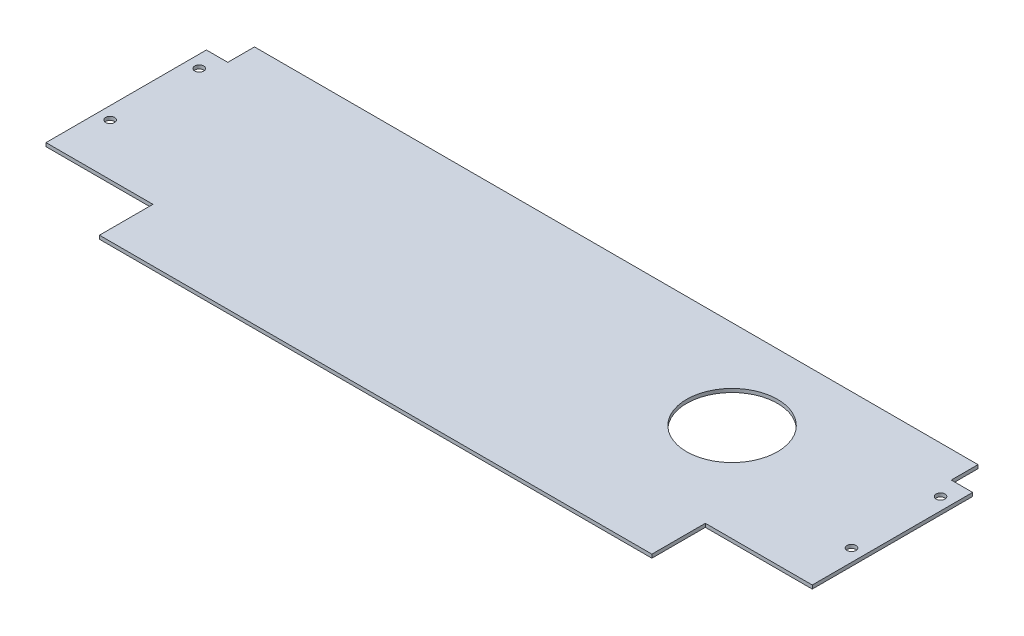
ISO-10303-21;
HEADER;
FILE_DESCRIPTION(('STEP AP214'),'2;1');
FILE_NAME('part.step','',(''),(''),'','','');
FILE_SCHEMA(('AUTOMOTIVE_DESIGN { 1 0 10303 214 1 1 1 1 }'));
ENDSEC;
DATA;
#1=APPLICATION_CONTEXT('core data for automotive mechanical design processes');
#2=APPLICATION_PROTOCOL_DEFINITION('international standard','automotive_design',2000,#1);
#3=PRODUCT_CONTEXT('',#1,'mechanical');
#4=PRODUCT('Part','Part','',(#3));
#5=PRODUCT_RELATED_PRODUCT_CATEGORY('part','',(#4));
#6=PRODUCT_DEFINITION_FORMATION('','',#4);
#7=PRODUCT_DEFINITION_CONTEXT('part definition',#1,'design');
#8=PRODUCT_DEFINITION('design','',#6,#7);
#9=PRODUCT_DEFINITION_SHAPE('','',#8);
#10=(LENGTH_UNIT() NAMED_UNIT(*) SI_UNIT(.MILLI.,.METRE.));
#11=(NAMED_UNIT(*) PLANE_ANGLE_UNIT() SI_UNIT($,.RADIAN.));
#12=(NAMED_UNIT(*) SI_UNIT($,.STERADIAN.) SOLID_ANGLE_UNIT());
#13=UNCERTAINTY_MEASURE_WITH_UNIT(LENGTH_MEASURE(1.E-05),#10,'distance_accuracy_value','');
#14=(GEOMETRIC_REPRESENTATION_CONTEXT(3) GLOBAL_UNCERTAINTY_ASSIGNED_CONTEXT((#13)) GLOBAL_UNIT_ASSIGNED_CONTEXT((#10,
#11,#12)) REPRESENTATION_CONTEXT('',''));
#15=CARTESIAN_POINT('',(0.,0.,0.));
#16=DIRECTION('',(0.,0.,1.));
#17=DIRECTION('',(1.,0.,0.));
#18=AXIS2_PLACEMENT_3D('',#15,#16,#17);
#19=CARTESIAN_POINT('',(0.,2.,0.));
#20=DIRECTION('',(1.,0.,0.));
#21=DIRECTION('',(0.,0.,-1.));
#22=AXIS2_PLACEMENT_3D('',#19,#20,#21);
#23=PLANE('',#22);
#24=DIRECTION('',(0.,0.,1.));
#25=VECTOR('',#24,1.);
#26=CARTESIAN_POINT('',(0.,0.,0.));
#27=LINE('',#26,#25);
#28=CARTESIAN_POINT('',(0.,0.,-120.));
#29=VERTEX_POINT('',#28);
#30=CARTESIAN_POINT('',(0.,0.,-30.));
#31=VERTEX_POINT('',#30);
#32=EDGE_CURVE('E147',#29,#31,#27,.T.);
#33=ORIENTED_EDGE('',*,*,#32,.T.);
#34=DIRECTION('',(0.,1.,0.));
#35=VECTOR('',#34,1.);
#36=CARTESIAN_POINT('',(0.,0.,-30.));
#37=LINE('',#36,#35);
#38=CARTESIAN_POINT('',(0.,2.,-30.));
#39=VERTEX_POINT('',#38);
#40=EDGE_CURVE('E202',#31,#39,#37,.T.);
#41=ORIENTED_EDGE('',*,*,#40,.T.);
#42=DIRECTION('',(0.,0.,1.));
#43=VECTOR('',#42,1.);
#44=CARTESIAN_POINT('',(0.,2.,0.));
#45=LINE('',#44,#43);
#46=CARTESIAN_POINT('',(0.,2.,-120.));
#47=VERTEX_POINT('',#46);
#48=EDGE_CURVE('E145',#47,#39,#45,.T.);
#49=ORIENTED_EDGE('',*,*,#48,.F.);
#50=DIRECTION('',(0.,1.,0.));
#51=VECTOR('',#50,1.);
#52=CARTESIAN_POINT('',(0.,0.,-120.));
#53=LINE('',#52,#51);
#54=EDGE_CURVE('E171',#29,#47,#53,.T.);
#55=ORIENTED_EDGE('',*,*,#54,.F.);
#56=EDGE_LOOP('',(#33,#41,#49,#55));
#57=FACE_BOUND('',#56,.T.);
#58=ADVANCED_FACE('F33',(#57),#23,.F.);
#59=CARTESIAN_POINT('',(0.,2.,0.));
#60=DIRECTION('',(0.,0.,-1.));
#61=DIRECTION('',(-1.,0.,0.));
#62=AXIS2_PLACEMENT_3D('',#59,#60,#61);
#63=PLANE('',#62);
#64=DIRECTION('',(1.,0.,0.));
#65=VECTOR('',#64,1.);
#66=CARTESIAN_POINT('',(0.,0.,0.));
#67=LINE('',#66,#65);
#68=CARTESIAN_POINT('',(60.,0.,0.));
#69=VERTEX_POINT('',#68);
#70=CARTESIAN_POINT('',(370.,0.,0.));
#71=VERTEX_POINT('',#70);
#72=EDGE_CURVE('E144',#69,#71,#67,.T.);
#73=ORIENTED_EDGE('',*,*,#72,.T.);
#74=DIRECTION('',(0.,1.,0.));
#75=VECTOR('',#74,1.);
#76=CARTESIAN_POINT('',(370.,0.,0.));
#77=LINE('',#76,#75);
#78=CARTESIAN_POINT('',(370.,2.,0.));
#79=VERTEX_POINT('',#78);
#80=EDGE_CURVE('E217',#71,#79,#77,.T.);
#81=ORIENTED_EDGE('',*,*,#80,.T.);
#82=DIRECTION('',(1.,0.,0.));
#83=VECTOR('',#82,1.);
#84=CARTESIAN_POINT('',(0.,2.,0.));
#85=LINE('',#84,#83);
#86=CARTESIAN_POINT('',(60.,2.,0.));
#87=VERTEX_POINT('',#86);
#88=EDGE_CURVE('E154',#87,#79,#85,.T.);
#89=ORIENTED_EDGE('',*,*,#88,.F.);
#90=DIRECTION('',(0.,1.,0.));
#91=VECTOR('',#90,1.);
#92=CARTESIAN_POINT('',(60.,0.,0.));
#93=LINE('',#92,#91);
#94=EDGE_CURVE('E205',#69,#87,#93,.T.);
#95=ORIENTED_EDGE('',*,*,#94,.F.);
#96=EDGE_LOOP('',(#73,#81,#89,#95));
#97=FACE_BOUND('',#96,.T.);
#98=ADVANCED_FACE('F275',(#97),#63,.F.);
#99=CARTESIAN_POINT('',(430.,2.,0.));
#100=DIRECTION('',(-1.,0.,0.));
#101=DIRECTION('',(0.,0.,1.));
#102=AXIS2_PLACEMENT_3D('',#99,#100,#101);
#103=PLANE('',#102);
#104=DIRECTION('',(0.,0.,-1.));
#105=VECTOR('',#104,1.);
#106=CARTESIAN_POINT('',(430.,2.,0.));
#107=LINE('',#106,#105);
#108=CARTESIAN_POINT('',(430.,2.,-30.));
#109=VERTEX_POINT('',#108);
#110=CARTESIAN_POINT('',(430.,2.,-120.));
#111=VERTEX_POINT('',#110);
#112=EDGE_CURVE('E41',#109,#111,#107,.T.);
#113=ORIENTED_EDGE('',*,*,#112,.F.);
#114=DIRECTION('',(0.,1.,0.));
#115=VECTOR('',#114,1.);
#116=CARTESIAN_POINT('',(430.,0.,-30.));
#117=LINE('',#116,#115);
#118=CARTESIAN_POINT('',(430.,0.,-30.));
#119=VERTEX_POINT('',#118);
#120=EDGE_CURVE('E125',#119,#109,#117,.T.);
#121=ORIENTED_EDGE('',*,*,#120,.F.);
#122=DIRECTION('',(0.,0.,-1.));
#123=VECTOR('',#122,1.);
#124=CARTESIAN_POINT('',(430.,0.,0.));
#125=LINE('',#124,#123);
#126=CARTESIAN_POINT('',(430.,0.,-120.));
#127=VERTEX_POINT('',#126);
#128=EDGE_CURVE('E136',#119,#127,#125,.T.);
#129=ORIENTED_EDGE('',*,*,#128,.T.);
#130=DIRECTION('',(0.,1.,0.));
#131=VECTOR('',#130,1.);
#132=CARTESIAN_POINT('',(430.,0.,-120.));
#133=LINE('',#132,#131);
#134=EDGE_CURVE('E185',#127,#111,#133,.T.);
#135=ORIENTED_EDGE('',*,*,#134,.T.);
#136=EDGE_LOOP('',(#113,#121,#129,#135));
#137=FACE_BOUND('',#136,.T.);
#138=ADVANCED_FACE('F134',(#137),#103,.F.);
#139=CARTESIAN_POINT('',(0.,2.,-135.));
#140=DIRECTION('',(0.,0.,1.));
#141=DIRECTION('',(1.,0.,0.));
#142=AXIS2_PLACEMENT_3D('',#139,#140,#141);
#143=PLANE('',#142);
#144=DIRECTION('',(-1.,0.,0.));
#145=VECTOR('',#144,1.);
#146=CARTESIAN_POINT('',(0.,2.,-135.));
#147=LINE('',#146,#145);
#148=CARTESIAN_POINT('',(418.,2.,-135.));
#149=VERTEX_POINT('',#148);
#150=CARTESIAN_POINT('',(12.,2.,-135.));
#151=VERTEX_POINT('',#150);
#152=EDGE_CURVE('E11',#149,#151,#147,.T.);
#153=ORIENTED_EDGE('',*,*,#152,.F.);
#154=DIRECTION('',(0.,1.,0.));
#155=VECTOR('',#154,1.);
#156=CARTESIAN_POINT('',(418.,0.,-135.));
#157=LINE('',#156,#155);
#158=CARTESIAN_POINT('',(418.,0.,-135.));
#159=VERTEX_POINT('',#158);
#160=EDGE_CURVE('E190',#159,#149,#157,.T.);
#161=ORIENTED_EDGE('',*,*,#160,.F.);
#162=DIRECTION('',(-1.,0.,0.));
#163=VECTOR('',#162,1.);
#164=CARTESIAN_POINT('',(0.,0.,-135.));
#165=LINE('',#164,#163);
#166=CARTESIAN_POINT('',(12.,0.,-135.));
#167=VERTEX_POINT('',#166);
#168=EDGE_CURVE('E36',#159,#167,#165,.T.);
#169=ORIENTED_EDGE('',*,*,#168,.T.);
#170=DIRECTION('',(0.,1.,0.));
#171=VECTOR('',#170,1.);
#172=CARTESIAN_POINT('',(12.,0.,-135.));
#173=LINE('',#172,#171);
#174=EDGE_CURVE('E168',#167,#151,#173,.T.);
#175=ORIENTED_EDGE('',*,*,#174,.T.);
#176=EDGE_LOOP('',(#153,#161,#169,#175));
#177=FACE_BOUND('',#176,.T.);
#178=ADVANCED_FACE('F259',(#177),#143,.F.);
#179=CARTESIAN_POINT('',(0.,2.,0.));
#180=DIRECTION('',(0.,-1.,0.));
#181=DIRECTION('',(0.,0.,-1.));
#182=AXIS2_PLACEMENT_3D('',#179,#180,#181);
#183=PLANE('',#182);
#184=CARTESIAN_POINT('',(330.,2.,-85.0000000000001));
#185=DIRECTION('',(0.,1.,0.));
#186=DIRECTION('',(0.,0.,1.));
#187=AXIS2_PLACEMENT_3D('',#184,#185,#186);
#188=CIRCLE('',#187,25.5);
#189=CARTESIAN_POINT('',(330.,2.,-59.5));
#190=VERTEX_POINT('',#189);
#191=EDGE_CURVE('E241',#190,#190,#188,.T.);
#192=ORIENTED_EDGE('',*,*,#191,.F.);
#193=EDGE_LOOP('',(#192));
#194=FACE_BOUND('',#193,.T.);
#195=CARTESIAN_POINT('',(7.00000000000001,2.,-58.9999999999999));
#196=DIRECTION('',(0.,1.,0.));
#197=DIRECTION('',(0.,0.,1.));
#198=AXIS2_PLACEMENT_3D('',#195,#196,#197);
#199=CIRCLE('',#198,2.5);
#200=CARTESIAN_POINT('',(7.00000000000001,2.,-56.4999999999999));
#201=VERTEX_POINT('',#200);
#202=EDGE_CURVE('E235',#201,#201,#199,.T.);
#203=ORIENTED_EDGE('',*,*,#202,.F.);
#204=EDGE_LOOP('',(#203));
#205=FACE_BOUND('',#204,.T.);
#206=CARTESIAN_POINT('',(423.,2.,-58.9999999999999));
#207=DIRECTION('',(0.,1.,0.));
#208=DIRECTION('',(0.,0.,-1.));
#209=AXIS2_PLACEMENT_3D('',#206,#207,#208);
#210=CIRCLE('',#209,2.49999999999997);
#211=CARTESIAN_POINT('',(423.,2.,-61.4999999999999));
#212=VERTEX_POINT('',#211);
#213=EDGE_CURVE('E229',#212,#212,#210,.T.);
#214=ORIENTED_EDGE('',*,*,#213,.F.);
#215=EDGE_LOOP('',(#214));
#216=FACE_BOUND('',#215,.T.);
#217=CARTESIAN_POINT('',(423.,2.,-109.));
#218=DIRECTION('',(0.,1.,0.));
#219=DIRECTION('',(0.,0.,-1.));
#220=AXIS2_PLACEMENT_3D('',#217,#218,#219);
#221=CIRCLE('',#220,2.50000000000002);
#222=CARTESIAN_POINT('',(423.,2.,-111.5));
#223=VERTEX_POINT('',#222);
#224=EDGE_CURVE('E165',#223,#223,#221,.T.);
#225=ORIENTED_EDGE('',*,*,#224,.F.);
#226=EDGE_LOOP('',(#225));
#227=FACE_BOUND('',#226,.T.);
#228=CARTESIAN_POINT('',(7.00000000000001,2.,-109.));
#229=DIRECTION('',(0.,1.,0.));
#230=DIRECTION('',(0.,0.,1.));
#231=AXIS2_PLACEMENT_3D('',#228,#229,#230);
#232=CIRCLE('',#231,2.5);
#233=CARTESIAN_POINT('',(7.00000000000001,2.,-106.5));
#234=VERTEX_POINT('',#233);
#235=EDGE_CURVE('E159',#234,#234,#232,.T.);
#236=ORIENTED_EDGE('',*,*,#235,.F.);
#237=EDGE_LOOP('',(#236));
#238=FACE_BOUND('',#237,.T.);
#239=ORIENTED_EDGE('',*,*,#88,.T.);
#240=DIRECTION('',(0.,0.,1.));
#241=VECTOR('',#240,1.);
#242=CARTESIAN_POINT('',(370.,2.,0.));
#243=LINE('',#242,#241);
#244=CARTESIAN_POINT('',(370.,2.,-30.));
#245=VERTEX_POINT('',#244);
#246=EDGE_CURVE('E130',#245,#79,#243,.T.);
#247=ORIENTED_EDGE('',*,*,#246,.F.);
#248=DIRECTION('',(-1.,0.,0.));
#249=VECTOR('',#248,1.);
#250=CARTESIAN_POINT('',(430.,2.,-30.));
#251=LINE('',#250,#249);
#252=EDGE_CURVE('E225',#109,#245,#251,.T.);
#253=ORIENTED_EDGE('',*,*,#252,.F.);
#254=ORIENTED_EDGE('',*,*,#112,.T.);
#255=DIRECTION('',(1.,0.,0.));
#256=VECTOR('',#255,1.);
#257=CARTESIAN_POINT('',(430.,2.,-120.));
#258=LINE('',#257,#256);
#259=CARTESIAN_POINT('',(418.,2.,-120.));
#260=VERTEX_POINT('',#259);
#261=EDGE_CURVE('E195',#260,#111,#258,.T.);
#262=ORIENTED_EDGE('',*,*,#261,.F.);
#263=DIRECTION('',(0.,0.,1.));
#264=VECTOR('',#263,1.);
#265=CARTESIAN_POINT('',(418.,2.,-135.));
#266=LINE('',#265,#264);
#267=EDGE_CURVE('E199',#149,#260,#266,.T.);
#268=ORIENTED_EDGE('',*,*,#267,.F.);
#269=ORIENTED_EDGE('',*,*,#152,.T.);
#270=DIRECTION('',(0.,0.,-1.));
#271=VECTOR('',#270,1.);
#272=CARTESIAN_POINT('',(12.,2.,-135.));
#273=LINE('',#272,#271);
#274=CARTESIAN_POINT('',(12.,2.,-120.));
#275=VERTEX_POINT('',#274);
#276=EDGE_CURVE('E178',#275,#151,#273,.T.);
#277=ORIENTED_EDGE('',*,*,#276,.F.);
#278=DIRECTION('',(1.,0.,0.));
#279=VECTOR('',#278,1.);
#280=CARTESIAN_POINT('',(0.,2.,-120.));
#281=LINE('',#280,#279);
#282=EDGE_CURVE('E182',#47,#275,#281,.T.);
#283=ORIENTED_EDGE('',*,*,#282,.F.);
#284=ORIENTED_EDGE('',*,*,#48,.T.);
#285=DIRECTION('',(-1.,0.,0.));
#286=VECTOR('',#285,1.);
#287=CARTESIAN_POINT('',(0.,2.,-30.));
#288=LINE('',#287,#286);
#289=CARTESIAN_POINT('',(60.,2.,-30.));
#290=VERTEX_POINT('',#289);
#291=EDGE_CURVE('E211',#290,#39,#288,.T.);
#292=ORIENTED_EDGE('',*,*,#291,.F.);
#293=DIRECTION('',(0.,0.,-1.));
#294=VECTOR('',#293,1.);
#295=CARTESIAN_POINT('',(60.,2.,0.));
#296=LINE('',#295,#294);
#297=EDGE_CURVE('E214',#87,#290,#296,.T.);
#298=ORIENTED_EDGE('',*,*,#297,.F.);
#299=EDGE_LOOP('',(#239,#247,#253,#254,#262,#268,#269,#277,#283,#284,#292,#298));
#300=FACE_BOUND('',#299,.T.);
#301=ADVANCED_FACE('F256',(#194,#205,#216,#227,#238,#300),#183,.F.);
#302=CARTESIAN_POINT('',(0.,0.,0.));
#303=DIRECTION('',(0.,-1.,0.));
#304=DIRECTION('',(0.,0.,-1.));
#305=AXIS2_PLACEMENT_3D('',#302,#303,#304);
#306=PLANE('',#305);
#307=CARTESIAN_POINT('',(330.,0.,-85.0000000000001));
#308=DIRECTION('',(0.,1.,0.));
#309=DIRECTION('',(0.,0.,1.));
#310=AXIS2_PLACEMENT_3D('',#307,#308,#309);
#311=CIRCLE('',#310,25.5);
#312=CARTESIAN_POINT('',(330.,0.,-59.5));
#313=VERTEX_POINT('',#312);
#314=EDGE_CURVE('E238',#313,#313,#311,.T.);
#315=ORIENTED_EDGE('',*,*,#314,.T.);
#316=EDGE_LOOP('',(#315));
#317=FACE_BOUND('',#316,.T.);
#318=CARTESIAN_POINT('',(7.00000000000001,0.,-58.9999999999999));
#319=DIRECTION('',(0.,1.,0.));
#320=DIRECTION('',(0.,0.,1.));
#321=AXIS2_PLACEMENT_3D('',#318,#319,#320);
#322=CIRCLE('',#321,2.5);
#323=CARTESIAN_POINT('',(7.00000000000001,0.,-56.4999999999999));
#324=VERTEX_POINT('',#323);
#325=EDGE_CURVE('E232',#324,#324,#322,.T.);
#326=ORIENTED_EDGE('',*,*,#325,.T.);
#327=EDGE_LOOP('',(#326));
#328=FACE_BOUND('',#327,.T.);
#329=CARTESIAN_POINT('',(423.,0.,-58.9999999999999));
#330=DIRECTION('',(0.,1.,0.));
#331=DIRECTION('',(0.,0.,-1.));
#332=AXIS2_PLACEMENT_3D('',#329,#330,#331);
#333=CIRCLE('',#332,2.49999999999997);
#334=CARTESIAN_POINT('',(423.,0.,-61.4999999999999));
#335=VERTEX_POINT('',#334);
#336=EDGE_CURVE('E227',#335,#335,#333,.T.);
#337=ORIENTED_EDGE('',*,*,#336,.T.);
#338=EDGE_LOOP('',(#337));
#339=FACE_BOUND('',#338,.T.);
#340=DIRECTION('',(0.,0.,1.));
#341=VECTOR('',#340,1.);
#342=CARTESIAN_POINT('',(370.,0.,0.));
#343=LINE('',#342,#341);
#344=CARTESIAN_POINT('',(370.,0.,-30.));
#345=VERTEX_POINT('',#344);
#346=EDGE_CURVE('E49',#345,#71,#343,.T.);
#347=ORIENTED_EDGE('',*,*,#346,.T.);
#348=ORIENTED_EDGE('',*,*,#72,.F.);
#349=DIRECTION('',(0.,0.,-1.));
#350=VECTOR('',#349,1.);
#351=CARTESIAN_POINT('',(60.,0.,0.));
#352=LINE('',#351,#350);
#353=CARTESIAN_POINT('',(60.,0.,-30.));
#354=VERTEX_POINT('',#353);
#355=EDGE_CURVE('E213',#69,#354,#352,.T.);
#356=ORIENTED_EDGE('',*,*,#355,.T.);
#357=DIRECTION('',(-1.,0.,0.));
#358=VECTOR('',#357,1.);
#359=CARTESIAN_POINT('',(0.,0.,-30.));
#360=LINE('',#359,#358);
#361=EDGE_CURVE('E57',#354,#31,#360,.T.);
#362=ORIENTED_EDGE('',*,*,#361,.T.);
#363=ORIENTED_EDGE('',*,*,#32,.F.);
#364=DIRECTION('',(1.,0.,0.));
#365=VECTOR('',#364,1.);
#366=CARTESIAN_POINT('',(0.,0.,-120.));
#367=LINE('',#366,#365);
#368=CARTESIAN_POINT('',(12.,0.,-120.));
#369=VERTEX_POINT('',#368);
#370=EDGE_CURVE('E181',#29,#369,#367,.T.);
#371=ORIENTED_EDGE('',*,*,#370,.T.);
#372=DIRECTION('',(0.,0.,-1.));
#373=VECTOR('',#372,1.);
#374=CARTESIAN_POINT('',(12.,0.,-135.));
#375=LINE('',#374,#373);
#376=EDGE_CURVE('E174',#369,#167,#375,.T.);
#377=ORIENTED_EDGE('',*,*,#376,.T.);
#378=ORIENTED_EDGE('',*,*,#168,.F.);
#379=DIRECTION('',(0.,0.,1.));
#380=VECTOR('',#379,1.);
#381=CARTESIAN_POINT('',(418.,0.,-135.));
#382=LINE('',#381,#380);
#383=CARTESIAN_POINT('',(418.,0.,-120.));
#384=VERTEX_POINT('',#383);
#385=EDGE_CURVE('E198',#159,#384,#382,.T.);
#386=ORIENTED_EDGE('',*,*,#385,.T.);
#387=DIRECTION('',(1.,0.,0.));
#388=VECTOR('',#387,1.);
#389=CARTESIAN_POINT('',(430.,0.,-120.));
#390=LINE('',#389,#388);
#391=EDGE_CURVE('E143',#384,#127,#390,.T.);
#392=ORIENTED_EDGE('',*,*,#391,.T.);
#393=ORIENTED_EDGE('',*,*,#128,.F.);
#394=DIRECTION('',(-1.,0.,0.));
#395=VECTOR('',#394,1.);
#396=CARTESIAN_POINT('',(430.,0.,-30.));
#397=LINE('',#396,#395);
#398=EDGE_CURVE('E121',#119,#345,#397,.T.);
#399=ORIENTED_EDGE('',*,*,#398,.T.);
#400=EDGE_LOOP('',(#347,#348,#356,#362,#363,#371,#377,#378,#386,#392,#393,#399));
#401=FACE_BOUND('',#400,.T.);
#402=CARTESIAN_POINT('',(423.,0.,-109.));
#403=DIRECTION('',(0.,1.,0.));
#404=DIRECTION('',(0.,0.,-1.));
#405=AXIS2_PLACEMENT_3D('',#402,#403,#404);
#406=CIRCLE('',#405,2.50000000000002);
#407=CARTESIAN_POINT('',(423.,0.,-111.5));
#408=VERTEX_POINT('',#407);
#409=EDGE_CURVE('E162',#408,#408,#406,.T.);
#410=ORIENTED_EDGE('',*,*,#409,.T.);
#411=EDGE_LOOP('',(#410));
#412=FACE_BOUND('',#411,.T.);
#413=CARTESIAN_POINT('',(7.00000000000001,0.,-109.));
#414=DIRECTION('',(0.,1.,0.));
#415=DIRECTION('',(0.,0.,1.));
#416=AXIS2_PLACEMENT_3D('',#413,#414,#415);
#417=CIRCLE('',#416,2.5);
#418=CARTESIAN_POINT('',(7.00000000000001,0.,-106.5));
#419=VERTEX_POINT('',#418);
#420=EDGE_CURVE('E151',#419,#419,#417,.T.);
#421=ORIENTED_EDGE('',*,*,#420,.T.);
#422=EDGE_LOOP('',(#421));
#423=FACE_BOUND('',#422,.T.);
#424=ADVANCED_FACE('F140',(#317,#328,#339,#401,#412,#423),#306,.T.);
#425=CARTESIAN_POINT('',(7.00000000000001,0.,-109.));
#426=DIRECTION('',(0.,1.,0.));
#427=DIRECTION('',(0.,0.,1.));
#428=AXIS2_PLACEMENT_3D('',#425,#426,#427);
#429=CYLINDRICAL_SURFACE('',#428,2.5);
#430=ORIENTED_EDGE('',*,*,#420,.F.);
#431=EDGE_LOOP('',(#430));
#432=FACE_BOUND('',#431,.T.);
#433=ORIENTED_EDGE('',*,*,#235,.T.);
#434=EDGE_LOOP('',(#433));
#435=FACE_BOUND('',#434,.T.);
#436=ADVANCED_FACE('F325',(#432,#435),#429,.F.);
#437=CARTESIAN_POINT('',(423.,0.,-109.));
#438=DIRECTION('',(0.,1.,0.));
#439=DIRECTION('',(0.,0.,1.));
#440=AXIS2_PLACEMENT_3D('',#437,#438,#439);
#441=CYLINDRICAL_SURFACE('',#440,2.50000000000002);
#442=ORIENTED_EDGE('',*,*,#409,.F.);
#443=EDGE_LOOP('',(#442));
#444=FACE_BOUND('',#443,.T.);
#445=ORIENTED_EDGE('',*,*,#224,.T.);
#446=EDGE_LOOP('',(#445));
#447=FACE_BOUND('',#446,.T.);
#448=ADVANCED_FACE('F329',(#444,#447),#441,.F.);
#449=CARTESIAN_POINT('',(12.,0.,-135.));
#450=DIRECTION('',(1.,0.,0.));
#451=DIRECTION('',(0.,0.,-1.));
#452=AXIS2_PLACEMENT_3D('',#449,#450,#451);
#453=PLANE('',#452);
#454=ORIENTED_EDGE('',*,*,#276,.T.);
#455=ORIENTED_EDGE('',*,*,#174,.F.);
#456=ORIENTED_EDGE('',*,*,#376,.F.);
#457=DIRECTION('',(0.,1.,0.));
#458=VECTOR('',#457,1.);
#459=CARTESIAN_POINT('',(12.,0.,-120.));
#460=LINE('',#459,#458);
#461=EDGE_CURVE('E173',#369,#275,#460,.T.);
#462=ORIENTED_EDGE('',*,*,#461,.T.);
#463=EDGE_LOOP('',(#454,#455,#456,#462));
#464=FACE_BOUND('',#463,.T.);
#465=ADVANCED_FACE('F293',(#464),#453,.F.);
#466=CARTESIAN_POINT('',(0.,0.,-120.));
#467=DIRECTION('',(0.,0.,1.));
#468=DIRECTION('',(1.,0.,0.));
#469=AXIS2_PLACEMENT_3D('',#466,#467,#468);
#470=PLANE('',#469);
#471=ORIENTED_EDGE('',*,*,#282,.T.);
#472=ORIENTED_EDGE('',*,*,#461,.F.);
#473=ORIENTED_EDGE('',*,*,#370,.F.);
#474=ORIENTED_EDGE('',*,*,#54,.T.);
#475=EDGE_LOOP('',(#471,#472,#473,#474));
#476=FACE_BOUND('',#475,.T.);
#477=ADVANCED_FACE('F289',(#476),#470,.F.);
#478=CARTESIAN_POINT('',(430.,0.,-120.));
#479=DIRECTION('',(0.,0.,1.));
#480=DIRECTION('',(1.,0.,0.));
#481=AXIS2_PLACEMENT_3D('',#478,#479,#480);
#482=PLANE('',#481);
#483=ORIENTED_EDGE('',*,*,#261,.T.);
#484=ORIENTED_EDGE('',*,*,#134,.F.);
#485=ORIENTED_EDGE('',*,*,#391,.F.);
#486=DIRECTION('',(0.,1.,0.));
#487=VECTOR('',#486,1.);
#488=CARTESIAN_POINT('',(418.,0.,-120.));
#489=LINE('',#488,#487);
#490=EDGE_CURVE('E192',#384,#260,#489,.T.);
#491=ORIENTED_EDGE('',*,*,#490,.T.);
#492=EDGE_LOOP('',(#483,#484,#485,#491));
#493=FACE_BOUND('',#492,.T.);
#494=ADVANCED_FACE('F303',(#493),#482,.F.);
#495=CARTESIAN_POINT('',(418.,0.,-135.));
#496=DIRECTION('',(-1.,0.,0.));
#497=DIRECTION('',(0.,0.,1.));
#498=AXIS2_PLACEMENT_3D('',#495,#496,#497);
#499=PLANE('',#498);
#500=ORIENTED_EDGE('',*,*,#267,.T.);
#501=ORIENTED_EDGE('',*,*,#490,.F.);
#502=ORIENTED_EDGE('',*,*,#385,.F.);
#503=ORIENTED_EDGE('',*,*,#160,.T.);
#504=EDGE_LOOP('',(#500,#501,#502,#503));
#505=FACE_BOUND('',#504,.T.);
#506=ADVANCED_FACE('F299',(#505),#499,.F.);
#507=CARTESIAN_POINT('',(0.,0.,-30.));
#508=DIRECTION('',(0.,0.,-1.));
#509=DIRECTION('',(-1.,0.,0.));
#510=AXIS2_PLACEMENT_3D('',#507,#508,#509);
#511=PLANE('',#510);
#512=ORIENTED_EDGE('',*,*,#291,.T.);
#513=ORIENTED_EDGE('',*,*,#40,.F.);
#514=ORIENTED_EDGE('',*,*,#361,.F.);
#515=DIRECTION('',(0.,1.,0.));
#516=VECTOR('',#515,1.);
#517=CARTESIAN_POINT('',(60.,0.,-30.));
#518=LINE('',#517,#516);
#519=EDGE_CURVE('E207',#354,#290,#518,.T.);
#520=ORIENTED_EDGE('',*,*,#519,.T.);
#521=EDGE_LOOP('',(#512,#513,#514,#520));
#522=FACE_BOUND('',#521,.T.);
#523=ADVANCED_FACE('F281',(#522),#511,.F.);
#524=CARTESIAN_POINT('',(60.,0.,0.));
#525=DIRECTION('',(1.,0.,0.));
#526=DIRECTION('',(0.,0.,-1.));
#527=AXIS2_PLACEMENT_3D('',#524,#525,#526);
#528=PLANE('',#527);
#529=ORIENTED_EDGE('',*,*,#297,.T.);
#530=ORIENTED_EDGE('',*,*,#519,.F.);
#531=ORIENTED_EDGE('',*,*,#355,.F.);
#532=ORIENTED_EDGE('',*,*,#94,.T.);
#533=EDGE_LOOP('',(#529,#530,#531,#532));
#534=FACE_BOUND('',#533,.T.);
#535=ADVANCED_FACE('F280',(#534),#528,.F.);
#536=CARTESIAN_POINT('',(370.,0.,0.));
#537=DIRECTION('',(-1.,0.,0.));
#538=DIRECTION('',(0.,0.,1.));
#539=AXIS2_PLACEMENT_3D('',#536,#537,#538);
#540=PLANE('',#539);
#541=ORIENTED_EDGE('',*,*,#246,.T.);
#542=ORIENTED_EDGE('',*,*,#80,.F.);
#543=ORIENTED_EDGE('',*,*,#346,.F.);
#544=DIRECTION('',(0.,1.,0.));
#545=VECTOR('',#544,1.);
#546=CARTESIAN_POINT('',(370.,0.,-30.));
#547=LINE('',#546,#545);
#548=EDGE_CURVE('E127',#345,#245,#547,.T.);
#549=ORIENTED_EDGE('',*,*,#548,.T.);
#550=EDGE_LOOP('',(#541,#542,#543,#549));
#551=FACE_BOUND('',#550,.T.);
#552=ADVANCED_FACE('F277',(#551),#540,.F.);
#553=CARTESIAN_POINT('',(430.,0.,-30.));
#554=DIRECTION('',(0.,0.,-1.));
#555=DIRECTION('',(-1.,0.,0.));
#556=AXIS2_PLACEMENT_3D('',#553,#554,#555);
#557=PLANE('',#556);
#558=ORIENTED_EDGE('',*,*,#252,.T.);
#559=ORIENTED_EDGE('',*,*,#548,.F.);
#560=ORIENTED_EDGE('',*,*,#398,.F.);
#561=ORIENTED_EDGE('',*,*,#120,.T.);
#562=EDGE_LOOP('',(#558,#559,#560,#561));
#563=FACE_BOUND('',#562,.T.);
#564=ADVANCED_FACE('F124',(#563),#557,.F.);
#565=CARTESIAN_POINT('',(423.,0.,-58.9999999999999));
#566=DIRECTION('',(0.,1.,0.));
#567=DIRECTION('',(0.,0.,1.));
#568=AXIS2_PLACEMENT_3D('',#565,#566,#567);
#569=CYLINDRICAL_SURFACE('',#568,2.49999999999997);
#570=ORIENTED_EDGE('',*,*,#336,.F.);
#571=EDGE_LOOP('',(#570));
#572=FACE_BOUND('',#571,.T.);
#573=ORIENTED_EDGE('',*,*,#213,.T.);
#574=EDGE_LOOP('',(#573));
#575=FACE_BOUND('',#574,.T.);
#576=ADVANCED_FACE('F385',(#572,#575),#569,.F.);
#577=CARTESIAN_POINT('',(7.00000000000001,0.,-58.9999999999999));
#578=DIRECTION('',(0.,1.,0.));
#579=DIRECTION('',(0.,0.,1.));
#580=AXIS2_PLACEMENT_3D('',#577,#578,#579);
#581=CYLINDRICAL_SURFACE('',#580,2.5);
#582=ORIENTED_EDGE('',*,*,#325,.F.);
#583=EDGE_LOOP('',(#582));
#584=FACE_BOUND('',#583,.T.);
#585=ORIENTED_EDGE('',*,*,#202,.T.);
#586=EDGE_LOOP('',(#585));
#587=FACE_BOUND('',#586,.T.);
#588=ADVANCED_FACE('F252',(#584,#587),#581,.F.);
#589=CARTESIAN_POINT('',(330.,0.,-85.0000000000001));
#590=DIRECTION('',(0.,1.,0.));
#591=DIRECTION('',(0.,0.,1.));
#592=AXIS2_PLACEMENT_3D('',#589,#590,#591);
#593=CYLINDRICAL_SURFACE('',#592,25.5);
#594=ORIENTED_EDGE('',*,*,#314,.F.);
#595=EDGE_LOOP('',(#594));
#596=FACE_BOUND('',#595,.T.);
#597=ORIENTED_EDGE('',*,*,#191,.T.);
#598=EDGE_LOOP('',(#597));
#599=FACE_BOUND('',#598,.T.);
#600=ADVANCED_FACE('F249',(#596,#599),#593,.F.);
#601=CLOSED_SHELL('',(#58,#98,#138,#178,#301,#424,#436,#448,#465,#477,#494,#506,#523,#535,#552,
#564,#576,#588,#600));
#602=MANIFOLD_SOLID_BREP('B2',#601);
#603=ADVANCED_BREP_SHAPE_REPRESENTATION('',(#18,#602),#14);
#604=SHAPE_DEFINITION_REPRESENTATION(#9,#603);
ENDSEC;
END-ISO-10303-21;
